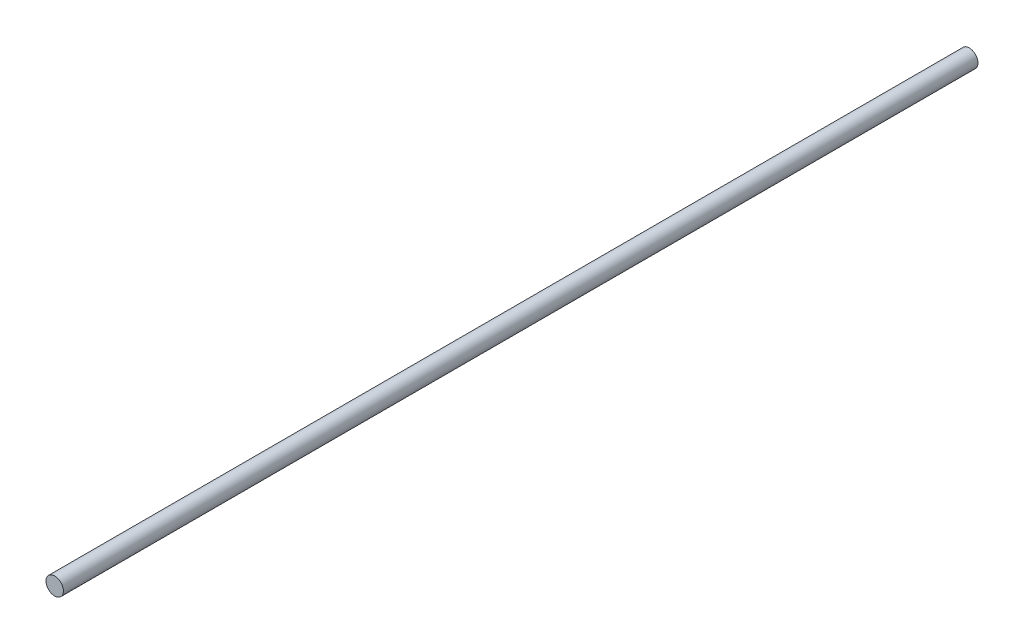
ISO-10303-21;
HEADER;
FILE_DESCRIPTION(('STEP AP214'),'2;1');
FILE_NAME('part.step','',(''),(''),'','','');
FILE_SCHEMA(('AUTOMOTIVE_DESIGN { 1 0 10303 214 1 1 1 1 }'));
ENDSEC;
DATA;
#1=APPLICATION_CONTEXT('core data for automotive mechanical design processes');
#2=APPLICATION_PROTOCOL_DEFINITION('international standard','automotive_design',2000,#1);
#3=PRODUCT_CONTEXT('',#1,'mechanical');
#4=PRODUCT('Part','Part','',(#3));
#5=PRODUCT_RELATED_PRODUCT_CATEGORY('part','',(#4));
#6=PRODUCT_DEFINITION_FORMATION('','',#4);
#7=PRODUCT_DEFINITION_CONTEXT('part definition',#1,'design');
#8=PRODUCT_DEFINITION('design','',#6,#7);
#9=PRODUCT_DEFINITION_SHAPE('','',#8);
#10=(LENGTH_UNIT() NAMED_UNIT(*) SI_UNIT(.MILLI.,.METRE.));
#11=(NAMED_UNIT(*) PLANE_ANGLE_UNIT() SI_UNIT($,.RADIAN.));
#12=(NAMED_UNIT(*) SI_UNIT($,.STERADIAN.) SOLID_ANGLE_UNIT());
#13=UNCERTAINTY_MEASURE_WITH_UNIT(LENGTH_MEASURE(1.E-05),#10,'distance_accuracy_value','');
#14=(GEOMETRIC_REPRESENTATION_CONTEXT(3) GLOBAL_UNCERTAINTY_ASSIGNED_CONTEXT((#13)) GLOBAL_UNIT_ASSIGNED_CONTEXT((#10,
#11,#12)) REPRESENTATION_CONTEXT('',''));
#15=CARTESIAN_POINT('',(0.,0.,0.));
#16=DIRECTION('',(0.,0.,1.));
#17=DIRECTION('',(1.,0.,0.));
#18=AXIS2_PLACEMENT_3D('',#15,#16,#17);
#19=CARTESIAN_POINT('',(0.,0.,105.));
#20=DIRECTION('',(0.,0.,-1.));
#21=DIRECTION('',(-1.,0.,0.));
#22=AXIS2_PLACEMENT_3D('',#19,#20,#21);
#23=CYLINDRICAL_SURFACE('',#22,1.);
#24=CARTESIAN_POINT('',(0.,0.,105.));
#25=DIRECTION('',(0.,0.,1.));
#26=DIRECTION('',(1.,0.,0.));
#27=AXIS2_PLACEMENT_3D('',#24,#25,#26);
#28=CIRCLE('',#27,1.);
#29=CARTESIAN_POINT('',(1.,0.,105.));
#30=VERTEX_POINT('',#29);
#31=EDGE_CURVE('E10',#30,#30,#28,.T.);
#32=ORIENTED_EDGE('',*,*,#31,.F.);
#33=EDGE_LOOP('',(#32));
#34=FACE_BOUND('',#33,.T.);
#35=CARTESIAN_POINT('',(0.,0.,0.));
#36=DIRECTION('',(0.,0.,1.));
#37=DIRECTION('',(1.,0.,0.));
#38=AXIS2_PLACEMENT_3D('',#35,#36,#37);
#39=CIRCLE('',#38,1.);
#40=CARTESIAN_POINT('',(1.,0.,0.));
#41=VERTEX_POINT('',#40);
#42=EDGE_CURVE('E38',#41,#41,#39,.T.);
#43=ORIENTED_EDGE('',*,*,#42,.T.);
#44=EDGE_LOOP('',(#43));
#45=FACE_BOUND('',#44,.T.);
#46=ADVANCED_FACE('F35',(#34,#45),#23,.T.);
#47=CARTESIAN_POINT('',(0.,0.,105.));
#48=DIRECTION('',(0.,0.,1.));
#49=DIRECTION('',(1.,0.,0.));
#50=AXIS2_PLACEMENT_3D('',#47,#48,#49);
#51=PLANE('',#50);
#52=ORIENTED_EDGE('',*,*,#31,.T.);
#53=EDGE_LOOP('',(#52));
#54=FACE_BOUND('',#53,.T.);
#55=ADVANCED_FACE('F50',(#54),#51,.T.);
#56=CARTESIAN_POINT('',(0.,0.,0.));
#57=DIRECTION('',(0.,0.,1.));
#58=DIRECTION('',(1.,0.,0.));
#59=AXIS2_PLACEMENT_3D('',#56,#57,#58);
#60=PLANE('',#59);
#61=ORIENTED_EDGE('',*,*,#42,.F.);
#62=EDGE_LOOP('',(#61));
#63=FACE_BOUND('',#62,.T.);
#64=ADVANCED_FACE('F48',(#63),#60,.F.);
#65=CLOSED_SHELL('',(#46,#55,#64));
#66=MANIFOLD_SOLID_BREP('B2',#65);
#67=ADVANCED_BREP_SHAPE_REPRESENTATION('',(#18,#66),#14);
#68=SHAPE_DEFINITION_REPRESENTATION(#9,#67);
ENDSEC;
END-ISO-10303-21;
